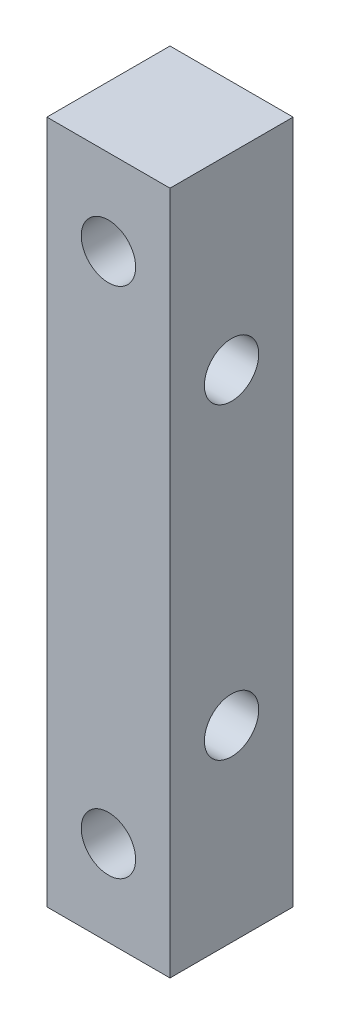
ISO-10303-21;
HEADER;
FILE_DESCRIPTION(('STEP AP214'),'2;1');
FILE_NAME('part.step','',(''),(''),'','','');
FILE_SCHEMA(('AUTOMOTIVE_DESIGN { 1 0 10303 214 1 1 1 1 }'));
ENDSEC;
DATA;
#1=APPLICATION_CONTEXT('core data for automotive mechanical design processes');
#2=APPLICATION_PROTOCOL_DEFINITION('international standard','automotive_design',2000,#1);
#3=PRODUCT_CONTEXT('',#1,'mechanical');
#4=PRODUCT('Part','Part','',(#3));
#5=PRODUCT_RELATED_PRODUCT_CATEGORY('part','',(#4));
#6=PRODUCT_DEFINITION_FORMATION('','',#4);
#7=PRODUCT_DEFINITION_CONTEXT('part definition',#1,'design');
#8=PRODUCT_DEFINITION('design','',#6,#7);
#9=PRODUCT_DEFINITION_SHAPE('','',#8);
#10=(LENGTH_UNIT() NAMED_UNIT(*) SI_UNIT(.MILLI.,.METRE.));
#11=(NAMED_UNIT(*) PLANE_ANGLE_UNIT() SI_UNIT($,.RADIAN.));
#12=(NAMED_UNIT(*) SI_UNIT($,.STERADIAN.) SOLID_ANGLE_UNIT());
#13=UNCERTAINTY_MEASURE_WITH_UNIT(LENGTH_MEASURE(1.E-05),#10,'distance_accuracy_value','');
#14=(GEOMETRIC_REPRESENTATION_CONTEXT(3) GLOBAL_UNCERTAINTY_ASSIGNED_CONTEXT((#13)) GLOBAL_UNIT_ASSIGNED_CONTEXT((#10,
#11,#12)) REPRESENTATION_CONTEXT('',''));
#15=CARTESIAN_POINT('',(0.,0.,0.));
#16=DIRECTION('',(0.,0.,1.));
#17=DIRECTION('',(1.,0.,0.));
#18=AXIS2_PLACEMENT_3D('',#15,#16,#17);
#19=CARTESIAN_POINT('',(4.572,50.8,-4.572));
#20=DIRECTION('',(-1.,0.,0.));
#21=DIRECTION('',(0.,0.,1.));
#22=AXIS2_PLACEMENT_3D('',#19,#20,#21);
#23=PLANE('',#22);
#24=CARTESIAN_POINT('',(4.572,36.83,0.));
#25=DIRECTION('',(1.,0.,0.));
#26=DIRECTION('',(0.,0.,-1.));
#27=AXIS2_PLACEMENT_3D('',#24,#25,#26);
#28=CIRCLE('',#27,2.01929999999999);
#29=CARTESIAN_POINT('',(4.572,36.83,-2.01929999999999));
#30=VERTEX_POINT('',#29);
#31=EDGE_CURVE('E138',#30,#30,#28,.T.);
#32=ORIENTED_EDGE('',*,*,#31,.F.);
#33=EDGE_LOOP('',(#32));
#34=FACE_BOUND('',#33,.T.);
#35=CARTESIAN_POINT('',(4.572,13.97,0.));
#36=DIRECTION('',(1.,0.,0.));
#37=DIRECTION('',(0.,0.,-1.));
#38=AXIS2_PLACEMENT_3D('',#35,#36,#37);
#39=CIRCLE('',#38,2.01929999999999);
#40=CARTESIAN_POINT('',(4.572,13.97,-2.01929999999999));
#41=VERTEX_POINT('',#40);
#42=EDGE_CURVE('E132',#41,#41,#39,.T.);
#43=ORIENTED_EDGE('',*,*,#42,.F.);
#44=EDGE_LOOP('',(#43));
#45=FACE_BOUND('',#44,.T.);
#46=DIRECTION('',(0.,0.,-1.));
#47=VECTOR('',#46,1.);
#48=CARTESIAN_POINT('',(4.572,0.,-4.572));
#49=LINE('',#48,#47);
#50=CARTESIAN_POINT('',(4.572,0.,4.572));
#51=VERTEX_POINT('',#50);
#52=CARTESIAN_POINT('',(4.572,0.,-4.572));
#53=VERTEX_POINT('',#52);
#54=EDGE_CURVE('E104',#51,#53,#49,.T.);
#55=ORIENTED_EDGE('',*,*,#54,.T.);
#56=DIRECTION('',(0.,-1.,0.));
#57=VECTOR('',#56,1.);
#58=CARTESIAN_POINT('',(4.572,50.8,-4.572));
#59=LINE('',#58,#57);
#60=CARTESIAN_POINT('',(4.572,50.8,-4.572));
#61=VERTEX_POINT('',#60);
#62=EDGE_CURVE('E11',#61,#53,#59,.T.);
#63=ORIENTED_EDGE('',*,*,#62,.F.);
#64=DIRECTION('',(0.,0.,-1.));
#65=VECTOR('',#64,1.);
#66=CARTESIAN_POINT('',(4.572,50.8,-4.572));
#67=LINE('',#66,#65);
#68=CARTESIAN_POINT('',(4.572,50.8,4.572));
#69=VERTEX_POINT('',#68);
#70=EDGE_CURVE('E92',#69,#61,#67,.T.);
#71=ORIENTED_EDGE('',*,*,#70,.F.);
#72=DIRECTION('',(0.,-1.,0.));
#73=VECTOR('',#72,1.);
#74=CARTESIAN_POINT('',(4.572,50.8,4.572));
#75=LINE('',#74,#73);
#76=EDGE_CURVE('E100',#69,#51,#75,.T.);
#77=ORIENTED_EDGE('',*,*,#76,.T.);
#78=EDGE_LOOP('',(#55,#63,#71,#77));
#79=FACE_BOUND('',#78,.T.);
#80=ADVANCED_FACE('F41',(#34,#45,#79),#23,.F.);
#81=CARTESIAN_POINT('',(-4.572,50.8,-4.572));
#82=DIRECTION('',(0.,0.,1.));
#83=DIRECTION('',(1.,0.,0.));
#84=AXIS2_PLACEMENT_3D('',#81,#82,#83);
#85=PLANE('',#84);
#86=CARTESIAN_POINT('',(0.,44.45,-4.572));
#87=DIRECTION('',(0.,0.,1.));
#88=DIRECTION('',(1.,0.,0.));
#89=AXIS2_PLACEMENT_3D('',#86,#87,#88);
#90=CIRCLE('',#89,2.0193);
#91=CARTESIAN_POINT('',(2.0193,44.45,-4.572));
#92=VERTEX_POINT('',#91);
#93=EDGE_CURVE('E123',#92,#92,#90,.T.);
#94=ORIENTED_EDGE('',*,*,#93,.T.);
#95=EDGE_LOOP('',(#94));
#96=FACE_BOUND('',#95,.T.);
#97=CARTESIAN_POINT('',(0.,6.34999999999999,-4.572));
#98=DIRECTION('',(0.,0.,1.));
#99=DIRECTION('',(1.,0.,0.));
#100=AXIS2_PLACEMENT_3D('',#97,#98,#99);
#101=CIRCLE('',#100,2.0193);
#102=CARTESIAN_POINT('',(2.0193,6.34999999999999,-4.572));
#103=VERTEX_POINT('',#102);
#104=EDGE_CURVE('E107',#103,#103,#101,.T.);
#105=ORIENTED_EDGE('',*,*,#104,.T.);
#106=EDGE_LOOP('',(#105));
#107=FACE_BOUND('',#106,.T.);
#108=DIRECTION('',(-1.,0.,0.));
#109=VECTOR('',#108,1.);
#110=CARTESIAN_POINT('',(-4.572,0.,-4.572));
#111=LINE('',#110,#109);
#112=CARTESIAN_POINT('',(-4.572,0.,-4.572));
#113=VERTEX_POINT('',#112);
#114=EDGE_CURVE('E96',#53,#113,#111,.T.);
#115=ORIENTED_EDGE('',*,*,#114,.T.);
#116=DIRECTION('',(0.,-1.,0.));
#117=VECTOR('',#116,1.);
#118=CARTESIAN_POINT('',(-4.572,50.8,-4.572));
#119=LINE('',#118,#117);
#120=CARTESIAN_POINT('',(-4.572,50.8,-4.572));
#121=VERTEX_POINT('',#120);
#122=EDGE_CURVE('E49',#121,#113,#119,.T.);
#123=ORIENTED_EDGE('',*,*,#122,.F.);
#124=DIRECTION('',(-1.,0.,0.));
#125=VECTOR('',#124,1.);
#126=CARTESIAN_POINT('',(-4.572,50.8,-4.572));
#127=LINE('',#126,#125);
#128=EDGE_CURVE('E87',#61,#121,#127,.T.);
#129=ORIENTED_EDGE('',*,*,#128,.F.);
#130=ORIENTED_EDGE('',*,*,#62,.T.);
#131=EDGE_LOOP('',(#115,#123,#129,#130));
#132=FACE_BOUND('',#131,.T.);
#133=ADVANCED_FACE('F95',(#96,#107,#132),#85,.F.);
#134=CARTESIAN_POINT('',(-4.572,50.8,-4.572));
#135=DIRECTION('',(1.,0.,0.));
#136=DIRECTION('',(0.,0.,-1.));
#137=AXIS2_PLACEMENT_3D('',#134,#135,#136);
#138=PLANE('',#137);
#139=CARTESIAN_POINT('',(-4.572,36.83,0.));
#140=DIRECTION('',(1.,0.,0.));
#141=DIRECTION('',(0.,0.,-1.));
#142=AXIS2_PLACEMENT_3D('',#139,#140,#141);
#143=CIRCLE('',#142,2.01929999999999);
#144=CARTESIAN_POINT('',(-4.572,36.83,-2.0193));
#145=VERTEX_POINT('',#144);
#146=EDGE_CURVE('E135',#145,#145,#143,.T.);
#147=ORIENTED_EDGE('',*,*,#146,.T.);
#148=EDGE_LOOP('',(#147));
#149=FACE_BOUND('',#148,.T.);
#150=CARTESIAN_POINT('',(-4.572,13.97,0.));
#151=DIRECTION('',(1.,0.,0.));
#152=DIRECTION('',(0.,0.,-1.));
#153=AXIS2_PLACEMENT_3D('',#150,#151,#152);
#154=CIRCLE('',#153,2.0193);
#155=CARTESIAN_POINT('',(-4.572,13.97,-2.0193));
#156=VERTEX_POINT('',#155);
#157=EDGE_CURVE('E129',#156,#156,#154,.T.);
#158=ORIENTED_EDGE('',*,*,#157,.T.);
#159=EDGE_LOOP('',(#158));
#160=FACE_BOUND('',#159,.T.);
#161=DIRECTION('',(0.,0.,1.));
#162=VECTOR('',#161,1.);
#163=CARTESIAN_POINT('',(-4.572,0.,-4.572));
#164=LINE('',#163,#162);
#165=CARTESIAN_POINT('',(-4.572,0.,4.572));
#166=VERTEX_POINT('',#165);
#167=EDGE_CURVE('E74',#113,#166,#164,.T.);
#168=ORIENTED_EDGE('',*,*,#167,.T.);
#169=DIRECTION('',(0.,-1.,0.));
#170=VECTOR('',#169,1.);
#171=CARTESIAN_POINT('',(-4.572,50.8,4.572));
#172=LINE('',#171,#170);
#173=CARTESIAN_POINT('',(-4.572,50.8,4.572));
#174=VERTEX_POINT('',#173);
#175=EDGE_CURVE('E97',#174,#166,#172,.T.);
#176=ORIENTED_EDGE('',*,*,#175,.F.);
#177=DIRECTION('',(0.,0.,1.));
#178=VECTOR('',#177,1.);
#179=CARTESIAN_POINT('',(-4.572,50.8,-4.572));
#180=LINE('',#179,#178);
#181=EDGE_CURVE('E90',#121,#174,#180,.T.);
#182=ORIENTED_EDGE('',*,*,#181,.F.);
#183=ORIENTED_EDGE('',*,*,#122,.T.);
#184=EDGE_LOOP('',(#168,#176,#182,#183));
#185=FACE_BOUND('',#184,.T.);
#186=ADVANCED_FACE('F98',(#149,#160,#185),#138,.F.);
#187=CARTESIAN_POINT('',(-4.572,50.8,4.572));
#188=DIRECTION('',(0.,0.,-1.));
#189=DIRECTION('',(-1.,0.,0.));
#190=AXIS2_PLACEMENT_3D('',#187,#188,#189);
#191=PLANE('',#190);
#192=CARTESIAN_POINT('',(0.,44.45,4.572));
#193=DIRECTION('',(0.,0.,1.));
#194=DIRECTION('',(1.,0.,0.));
#195=AXIS2_PLACEMENT_3D('',#192,#193,#194);
#196=CIRCLE('',#195,2.01929999999999);
#197=CARTESIAN_POINT('',(2.01929999999999,44.45,4.572));
#198=VERTEX_POINT('',#197);
#199=EDGE_CURVE('E126',#198,#198,#196,.T.);
#200=ORIENTED_EDGE('',*,*,#199,.F.);
#201=EDGE_LOOP('',(#200));
#202=FACE_BOUND('',#201,.T.);
#203=CARTESIAN_POINT('',(0.,6.34999999999999,4.572));
#204=DIRECTION('',(0.,0.,1.));
#205=DIRECTION('',(1.,0.,0.));
#206=AXIS2_PLACEMENT_3D('',#203,#204,#205);
#207=CIRCLE('',#206,2.01929999999999);
#208=CARTESIAN_POINT('',(2.01929999999999,6.34999999999999,4.572));
#209=VERTEX_POINT('',#208);
#210=EDGE_CURVE('E120',#209,#209,#207,.T.);
#211=ORIENTED_EDGE('',*,*,#210,.F.);
#212=EDGE_LOOP('',(#211));
#213=FACE_BOUND('',#212,.T.);
#214=DIRECTION('',(1.,0.,0.));
#215=VECTOR('',#214,1.);
#216=CARTESIAN_POINT('',(-4.572,0.,4.572));
#217=LINE('',#216,#215);
#218=EDGE_CURVE('E80',#166,#51,#217,.T.);
#219=ORIENTED_EDGE('',*,*,#218,.T.);
#220=ORIENTED_EDGE('',*,*,#76,.F.);
#221=DIRECTION('',(1.,0.,0.));
#222=VECTOR('',#221,1.);
#223=CARTESIAN_POINT('',(-4.572,50.8,4.572));
#224=LINE('',#223,#222);
#225=EDGE_CURVE('E57',#174,#69,#224,.T.);
#226=ORIENTED_EDGE('',*,*,#225,.F.);
#227=ORIENTED_EDGE('',*,*,#175,.T.);
#228=EDGE_LOOP('',(#219,#220,#226,#227));
#229=FACE_BOUND('',#228,.T.);
#230=ADVANCED_FACE('F112',(#202,#213,#229),#191,.F.);
#231=CARTESIAN_POINT('',(0.,50.8,0.));
#232=DIRECTION('',(0.,1.,0.));
#233=DIRECTION('',(0.,0.,1.));
#234=AXIS2_PLACEMENT_3D('',#231,#232,#233);
#235=PLANE('',#234);
#236=ORIENTED_EDGE('',*,*,#70,.T.);
#237=ORIENTED_EDGE('',*,*,#128,.T.);
#238=ORIENTED_EDGE('',*,*,#181,.T.);
#239=ORIENTED_EDGE('',*,*,#225,.T.);
#240=EDGE_LOOP('',(#236,#237,#238,#239));
#241=FACE_BOUND('',#240,.T.);
#242=ADVANCED_FACE('F88',(#241),#235,.T.);
#243=CARTESIAN_POINT('',(0.,0.,0.));
#244=DIRECTION('',(0.,1.,0.));
#245=DIRECTION('',(0.,0.,1.));
#246=AXIS2_PLACEMENT_3D('',#243,#244,#245);
#247=PLANE('',#246);
#248=ORIENTED_EDGE('',*,*,#54,.F.);
#249=ORIENTED_EDGE('',*,*,#218,.F.);
#250=ORIENTED_EDGE('',*,*,#167,.F.);
#251=ORIENTED_EDGE('',*,*,#114,.F.);
#252=EDGE_LOOP('',(#248,#249,#250,#251));
#253=FACE_BOUND('',#252,.T.);
#254=ADVANCED_FACE('F115',(#253),#247,.F.);
#255=CARTESIAN_POINT('',(0.,6.34999999999999,4.572));
#256=DIRECTION('',(0.,0.,1.));
#257=DIRECTION('',(1.,0.,0.));
#258=AXIS2_PLACEMENT_3D('',#255,#256,#257);
#259=CYLINDRICAL_SURFACE('',#258,2.01929999999999);
#260=ORIENTED_EDGE('',*,*,#104,.F.);
#261=EDGE_LOOP('',(#260));
#262=FACE_BOUND('',#261,.T.);
#263=ORIENTED_EDGE('',*,*,#210,.T.);
#264=EDGE_LOOP('',(#263));
#265=FACE_BOUND('',#264,.T.);
#266=ADVANCED_FACE('F159',(#262,#265),#259,.F.);
#267=CARTESIAN_POINT('',(0.,44.45,4.572));
#268=DIRECTION('',(0.,0.,1.));
#269=DIRECTION('',(1.,0.,0.));
#270=AXIS2_PLACEMENT_3D('',#267,#268,#269);
#271=CYLINDRICAL_SURFACE('',#270,2.01929999999999);
#272=ORIENTED_EDGE('',*,*,#93,.F.);
#273=EDGE_LOOP('',(#272));
#274=FACE_BOUND('',#273,.T.);
#275=ORIENTED_EDGE('',*,*,#199,.T.);
#276=EDGE_LOOP('',(#275));
#277=FACE_BOUND('',#276,.T.);
#278=ADVANCED_FACE('F150',(#274,#277),#271,.F.);
#279=CARTESIAN_POINT('',(4.572,13.97,0.));
#280=DIRECTION('',(1.,0.,0.));
#281=DIRECTION('',(0.,0.,-1.));
#282=AXIS2_PLACEMENT_3D('',#279,#280,#281);
#283=CYLINDRICAL_SURFACE('',#282,2.01929999999999);
#284=ORIENTED_EDGE('',*,*,#157,.F.);
#285=EDGE_LOOP('',(#284));
#286=FACE_BOUND('',#285,.T.);
#287=ORIENTED_EDGE('',*,*,#42,.T.);
#288=EDGE_LOOP('',(#287));
#289=FACE_BOUND('',#288,.T.);
#290=ADVANCED_FACE('F148',(#286,#289),#283,.F.);
#291=CARTESIAN_POINT('',(4.572,36.83,0.));
#292=DIRECTION('',(1.,0.,0.));
#293=DIRECTION('',(0.,0.,-1.));
#294=AXIS2_PLACEMENT_3D('',#291,#292,#293);
#295=CYLINDRICAL_SURFACE('',#294,2.01929999999999);
#296=ORIENTED_EDGE('',*,*,#146,.F.);
#297=EDGE_LOOP('',(#296));
#298=FACE_BOUND('',#297,.T.);
#299=ORIENTED_EDGE('',*,*,#31,.T.);
#300=EDGE_LOOP('',(#299));
#301=FACE_BOUND('',#300,.T.);
#302=ADVANCED_FACE('F142',(#298,#301),#295,.F.);
#303=CLOSED_SHELL('',(#80,#133,#186,#230,#242,#254,#266,#278,#290,#302));
#304=MANIFOLD_SOLID_BREP('B2',#303);
#305=ADVANCED_BREP_SHAPE_REPRESENTATION('',(#18,#304),#14);
#306=SHAPE_DEFINITION_REPRESENTATION(#9,#305);
ENDSEC;
END-ISO-10303-21;
